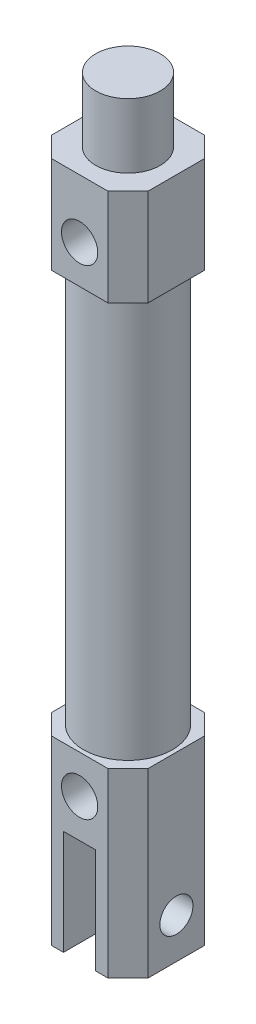
ISO-10303-21;
HEADER;
FILE_DESCRIPTION(('STEP AP214'),'2;1');
FILE_NAME('part.step','',(''),(''),'','','');
FILE_SCHEMA(('AUTOMOTIVE_DESIGN { 1 0 10303 214 1 1 1 1 }'));
ENDSEC;
DATA;
#1=APPLICATION_CONTEXT('core data for automotive mechanical design processes');
#2=APPLICATION_PROTOCOL_DEFINITION('international standard','automotive_design',2000,#1);
#3=PRODUCT_CONTEXT('',#1,'mechanical');
#4=PRODUCT('Part','Part','',(#3));
#5=PRODUCT_RELATED_PRODUCT_CATEGORY('part','',(#4));
#6=PRODUCT_DEFINITION_FORMATION('','',#4);
#7=PRODUCT_DEFINITION_CONTEXT('part definition',#1,'design');
#8=PRODUCT_DEFINITION('design','',#6,#7);
#9=PRODUCT_DEFINITION_SHAPE('','',#8);
#10=(LENGTH_UNIT() NAMED_UNIT(*) SI_UNIT(.MILLI.,.METRE.));
#11=(NAMED_UNIT(*) PLANE_ANGLE_UNIT() SI_UNIT($,.RADIAN.));
#12=(NAMED_UNIT(*) SI_UNIT($,.STERADIAN.) SOLID_ANGLE_UNIT());
#13=UNCERTAINTY_MEASURE_WITH_UNIT(LENGTH_MEASURE(1.E-05),#10,'distance_accuracy_value','');
#14=(GEOMETRIC_REPRESENTATION_CONTEXT(3) GLOBAL_UNCERTAINTY_ASSIGNED_CONTEXT((#13)) GLOBAL_UNIT_ASSIGNED_CONTEXT((#10,
#11,#12)) REPRESENTATION_CONTEXT('',''));
#15=CARTESIAN_POINT('',(0.,0.,0.));
#16=DIRECTION('',(0.,0.,1.));
#17=DIRECTION('',(1.,0.,0.));
#18=AXIS2_PLACEMENT_3D('',#15,#16,#17);
#19=CARTESIAN_POINT('',(0.,0.,0.));
#20=DIRECTION('',(0.,-1.,0.));
#21=DIRECTION('',(0.,0.,-1.));
#22=AXIS2_PLACEMENT_3D('',#19,#20,#21);
#23=PLANE('',#22);
#24=DIRECTION('',(0.,0.,1.));
#25=VECTOR('',#24,1.);
#26=CARTESIAN_POINT('',(-2.000000064,0.,-5.999999938));
#27=LINE('',#26,#25);
#28=CARTESIAN_POINT('',(-2.000000064,0.,-5.999999938));
#29=VERTEX_POINT('',#28);
#30=CARTESIAN_POINT('',(-2.000000064,0.,5.999999938));
#31=VERTEX_POINT('',#30);
#32=EDGE_CURVE('E207',#29,#31,#27,.T.);
#33=ORIENTED_EDGE('',*,*,#32,.T.);
#34=DIRECTION('',(1.,0.,0.));
#35=VECTOR('',#34,1.);
#36=CARTESIAN_POINT('',(-5.999999938,0.,5.999999938));
#37=LINE('',#36,#35);
#38=CARTESIAN_POINT('',(-3.49999985799998,0.,5.999999938));
#39=VERTEX_POINT('',#38);
#40=EDGE_CURVE('E250',#39,#31,#37,.T.);
#41=ORIENTED_EDGE('',*,*,#40,.F.);
#42=DIRECTION('',(0.707106781186546,0.,0.707106781186549));
#43=VECTOR('',#42,1.);
#44=CARTESIAN_POINT('',(-4.749999898,0.,4.74999989799997));
#45=LINE('',#44,#43);
#46=CARTESIAN_POINT('',(-5.999999938,0.,3.49999985799996));
#47=VERTEX_POINT('',#46);
#48=EDGE_CURVE('E271',#39,#47,#45,.F.);
#49=ORIENTED_EDGE('',*,*,#48,.T.);
#50=DIRECTION('',(0.,0.,1.));
#51=VECTOR('',#50,1.);
#52=CARTESIAN_POINT('',(-5.999999938,0.,5.999999938));
#53=LINE('',#52,#51);
#54=CARTESIAN_POINT('',(-5.999999938,0.,-3.49999985799998));
#55=VERTEX_POINT('',#54);
#56=EDGE_CURVE('E240',#55,#47,#53,.T.);
#57=ORIENTED_EDGE('',*,*,#56,.F.);
#58=DIRECTION('',(-0.707106781186549,0.,0.707106781186546));
#59=VECTOR('',#58,1.);
#60=CARTESIAN_POINT('',(-4.74999989799997,0.,-4.749999898));
#61=LINE('',#60,#59);
#62=CARTESIAN_POINT('',(-3.49999985799996,0.,-5.999999938));
#63=VERTEX_POINT('',#62);
#64=EDGE_CURVE('E231',#55,#63,#61,.F.);
#65=ORIENTED_EDGE('',*,*,#64,.T.);
#66=DIRECTION('',(-1.,0.,0.));
#67=VECTOR('',#66,1.);
#68=CARTESIAN_POINT('',(-5.999999938,0.,-5.999999938));
#69=LINE('',#68,#67);
#70=EDGE_CURVE('E224',#29,#63,#69,.T.);
#71=ORIENTED_EDGE('',*,*,#70,.F.);
#72=EDGE_LOOP('',(#33,#41,#49,#57,#65,#71));
#73=FACE_BOUND('',#72,.T.);
#74=ADVANCED_FACE('F51',(#73),#23,.T.);
#75=CARTESIAN_POINT('',(5.999999938,22.499999958,5.999999938));
#76=DIRECTION('',(-1.,0.,0.));
#77=DIRECTION('',(0.,0.,1.));
#78=AXIS2_PLACEMENT_3D('',#75,#76,#77);
#79=PLANE('',#78);
#80=CARTESIAN_POINT('',(5.999999938,4.999999906,0.));
#81=DIRECTION('',(1.,0.,0.));
#82=DIRECTION('',(0.,0.,-1.));
#83=AXIS2_PLACEMENT_3D('',#80,#81,#82);
#84=CIRCLE('',#83,2.049999964);
#85=CARTESIAN_POINT('',(5.999999938,4.999999906,-2.049999964));
#86=VERTEX_POINT('',#85);
#87=EDGE_CURVE('E616',#86,#86,#84,.T.);
#88=ORIENTED_EDGE('',*,*,#87,.F.);
#89=EDGE_LOOP('',(#88));
#90=FACE_BOUND('',#89,.T.);
#91=DIRECTION('',(0.,0.,-1.));
#92=VECTOR('',#91,1.);
#93=CARTESIAN_POINT('',(5.999999938,0.,5.999999938));
#94=LINE('',#93,#92);
#95=CARTESIAN_POINT('',(5.999999938,0.,3.49999985799998));
#96=VERTEX_POINT('',#95);
#97=CARTESIAN_POINT('',(5.999999938,0.,-3.49999985799996));
#98=VERTEX_POINT('',#97);
#99=EDGE_CURVE('E235',#96,#98,#94,.T.);
#100=ORIENTED_EDGE('',*,*,#99,.T.);
#101=DIRECTION('',(0.,1.,0.));
#102=VECTOR('',#101,1.);
#103=CARTESIAN_POINT('',(5.999999938,22.499999958,-3.49999985799996));
#104=LINE('',#103,#102);
#105=CARTESIAN_POINT('',(5.999999938,22.499999958,-3.49999985799996));
#106=VERTEX_POINT('',#105);
#107=EDGE_CURVE('E304',#98,#106,#104,.T.);
#108=ORIENTED_EDGE('',*,*,#107,.T.);
#109=DIRECTION('',(0.,0.,-1.));
#110=VECTOR('',#109,1.);
#111=CARTESIAN_POINT('',(5.999999938,22.499999958,5.999999938));
#112=LINE('',#111,#110);
#113=CARTESIAN_POINT('',(5.999999938,22.499999958,3.49999985799998));
#114=VERTEX_POINT('',#113);
#115=EDGE_CURVE('E253',#114,#106,#112,.T.);
#116=ORIENTED_EDGE('',*,*,#115,.F.);
#117=DIRECTION('',(0.,-1.,0.));
#118=VECTOR('',#117,1.);
#119=CARTESIAN_POINT('',(5.999999938,22.499999958,3.49999985799998));
#120=LINE('',#119,#118);
#121=EDGE_CURVE('E300',#114,#96,#120,.T.);
#122=ORIENTED_EDGE('',*,*,#121,.T.);
#123=EDGE_LOOP('',(#100,#108,#116,#122));
#124=FACE_BOUND('',#123,.T.);
#125=ADVANCED_FACE('F432',(#90,#124),#79,.F.);
#126=CARTESIAN_POINT('',(-5.999999938,22.499999958,-5.999999938));
#127=DIRECTION('',(0.,0.,1.));
#128=DIRECTION('',(1.,0.,0.));
#129=AXIS2_PLACEMENT_3D('',#126,#127,#128);
#130=PLANE('',#129);
#131=DIRECTION('',(-1.,0.,0.));
#132=VECTOR('',#131,1.);
#133=CARTESIAN_POINT('',(-2.000000064,12.999999908,-5.999999938));
#134=LINE('',#133,#132);
#135=CARTESIAN_POINT('',(2.000000064,12.999999908,-5.999999938));
#136=VERTEX_POINT('',#135);
#137=CARTESIAN_POINT('',(-2.000000064,12.999999908,-5.999999938));
#138=VERTEX_POINT('',#137);
#139=EDGE_CURVE('E220',#136,#138,#134,.T.);
#140=ORIENTED_EDGE('',*,*,#139,.T.);
#141=DIRECTION('',(0.,-1.,0.));
#142=VECTOR('',#141,1.);
#143=CARTESIAN_POINT('',(-2.000000064,0.,-5.999999938));
#144=LINE('',#143,#142);
#145=EDGE_CURVE('E210',#138,#29,#144,.T.);
#146=ORIENTED_EDGE('',*,*,#145,.T.);
#147=ORIENTED_EDGE('',*,*,#70,.T.);
#148=DIRECTION('',(0.,1.,0.));
#149=VECTOR('',#148,1.);
#150=CARTESIAN_POINT('',(-3.49999985799996,22.499999958,-5.999999938));
#151=LINE('',#150,#149);
#152=CARTESIAN_POINT('',(-3.49999985799996,22.499999958,-5.999999938));
#153=VERTEX_POINT('',#152);
#154=EDGE_CURVE('E297',#63,#153,#151,.T.);
#155=ORIENTED_EDGE('',*,*,#154,.T.);
#156=DIRECTION('',(-1.,0.,0.));
#157=VECTOR('',#156,1.);
#158=CARTESIAN_POINT('',(-5.999999938,22.499999958,-5.999999938));
#159=LINE('',#158,#157);
#160=CARTESIAN_POINT('',(3.49999985799998,22.499999958,-5.999999938));
#161=VERTEX_POINT('',#160);
#162=EDGE_CURVE('E408',#161,#153,#159,.T.);
#163=ORIENTED_EDGE('',*,*,#162,.F.);
#164=DIRECTION('',(0.,-1.,0.));
#165=VECTOR('',#164,1.);
#166=CARTESIAN_POINT('',(3.49999985799998,22.499999958,-5.999999938));
#167=LINE('',#166,#165);
#168=CARTESIAN_POINT('',(3.49999985799998,0.,-5.999999938));
#169=VERTEX_POINT('',#168);
#170=EDGE_CURVE('E293',#161,#169,#167,.T.);
#171=ORIENTED_EDGE('',*,*,#170,.T.);
#172=CARTESIAN_POINT('',(2.000000064,0.,-5.999999938));
#173=VERTEX_POINT('',#172);
#174=EDGE_CURVE('E234',#169,#173,#69,.T.);
#175=ORIENTED_EDGE('',*,*,#174,.T.);
#176=DIRECTION('',(0.,1.,0.));
#177=VECTOR('',#176,1.);
#178=CARTESIAN_POINT('',(2.000000064,0.,-5.999999938));
#179=LINE('',#178,#177);
#180=EDGE_CURVE('E69',#173,#136,#179,.T.);
#181=ORIENTED_EDGE('',*,*,#180,.T.);
#182=EDGE_LOOP('',(#140,#146,#147,#155,#163,#171,#175,#181));
#183=FACE_BOUND('',#182,.T.);
#184=ADVANCED_FACE('F223',(#183),#130,.F.);
#185=CARTESIAN_POINT('',(-5.999999938,22.499999958,5.999999938));
#186=DIRECTION('',(1.,0.,0.));
#187=DIRECTION('',(0.,0.,-1.));
#188=AXIS2_PLACEMENT_3D('',#185,#186,#187);
#189=PLANE('',#188);
#190=CARTESIAN_POINT('',(-5.999999938,4.999999906,0.));
#191=DIRECTION('',(1.,0.,0.));
#192=DIRECTION('',(0.,0.,-1.));
#193=AXIS2_PLACEMENT_3D('',#190,#191,#192);
#194=CIRCLE('',#193,2.049999964);
#195=CARTESIAN_POINT('',(-5.999999938,4.999999906,-2.049999964));
#196=VERTEX_POINT('',#195);
#197=EDGE_CURVE('E618',#196,#196,#194,.T.);
#198=ORIENTED_EDGE('',*,*,#197,.T.);
#199=EDGE_LOOP('',(#198));
#200=FACE_BOUND('',#199,.T.);
#201=ORIENTED_EDGE('',*,*,#56,.T.);
#202=DIRECTION('',(0.,1.,0.));
#203=VECTOR('',#202,1.);
#204=CARTESIAN_POINT('',(-5.999999938,22.499999958,3.49999985799996));
#205=LINE('',#204,#203);
#206=CARTESIAN_POINT('',(-5.999999938,22.499999958,3.49999985799996));
#207=VERTEX_POINT('',#206);
#208=EDGE_CURVE('E278',#47,#207,#205,.T.);
#209=ORIENTED_EDGE('',*,*,#208,.T.);
#210=DIRECTION('',(0.,0.,1.));
#211=VECTOR('',#210,1.);
#212=CARTESIAN_POINT('',(-5.999999938,22.499999958,5.999999938));
#213=LINE('',#212,#211);
#214=CARTESIAN_POINT('',(-5.999999938,22.499999958,-3.49999985799998));
#215=VERTEX_POINT('',#214);
#216=EDGE_CURVE('E412',#215,#207,#213,.T.);
#217=ORIENTED_EDGE('',*,*,#216,.F.);
#218=DIRECTION('',(0.,-1.,0.));
#219=VECTOR('',#218,1.);
#220=CARTESIAN_POINT('',(-5.999999938,22.499999958,-3.49999985799998));
#221=LINE('',#220,#219);
#222=EDGE_CURVE('E274',#215,#55,#221,.T.);
#223=ORIENTED_EDGE('',*,*,#222,.T.);
#224=EDGE_LOOP('',(#201,#209,#217,#223));
#225=FACE_BOUND('',#224,.T.);
#226=ADVANCED_FACE('F449',(#200,#225),#189,.F.);
#227=CARTESIAN_POINT('',(-5.999999938,22.499999958,5.999999938));
#228=DIRECTION('',(0.,0.,-1.));
#229=DIRECTION('',(-1.,0.,0.));
#230=AXIS2_PLACEMENT_3D('',#227,#228,#229);
#231=PLANE('',#230);
#232=CARTESIAN_POINT('',(0.,17.749999806,5.999999938));
#233=DIRECTION('',(0.,0.,1.));
#234=DIRECTION('',(1.,0.,0.));
#235=AXIS2_PLACEMENT_3D('',#232,#233,#234);
#236=CIRCLE('',#235,2.250000072);
#237=CARTESIAN_POINT('',(2.250000072,17.749999806,5.999999938));
#238=VERTEX_POINT('',#237);
#239=EDGE_CURVE('E603',#238,#238,#236,.T.);
#240=ORIENTED_EDGE('',*,*,#239,.F.);
#241=EDGE_LOOP('',(#240));
#242=FACE_BOUND('',#241,.T.);
#243=ORIENTED_EDGE('',*,*,#40,.T.);
#244=DIRECTION('',(0.,-1.,0.));
#245=VECTOR('',#244,1.);
#246=CARTESIAN_POINT('',(-2.000000064,0.,5.999999938));
#247=LINE('',#246,#245);
#248=CARTESIAN_POINT('',(-2.000000064,12.999999908,5.999999938));
#249=VERTEX_POINT('',#248);
#250=EDGE_CURVE('E213',#249,#31,#247,.T.);
#251=ORIENTED_EDGE('',*,*,#250,.F.);
#252=DIRECTION('',(-1.,0.,0.));
#253=VECTOR('',#252,1.);
#254=CARTESIAN_POINT('',(-2.000000064,12.999999908,5.999999938));
#255=LINE('',#254,#253);
#256=CARTESIAN_POINT('',(2.000000064,12.999999908,5.999999938));
#257=VERTEX_POINT('',#256);
#258=EDGE_CURVE('E228',#257,#249,#255,.T.);
#259=ORIENTED_EDGE('',*,*,#258,.F.);
#260=DIRECTION('',(0.,1.,0.));
#261=VECTOR('',#260,1.);
#262=CARTESIAN_POINT('',(2.000000064,0.,5.999999938));
#263=LINE('',#262,#261);
#264=CARTESIAN_POINT('',(2.000000064,0.,5.999999938));
#265=VERTEX_POINT('',#264);
#266=EDGE_CURVE('E458',#265,#257,#263,.T.);
#267=ORIENTED_EDGE('',*,*,#266,.F.);
#268=CARTESIAN_POINT('',(3.49999985799996,0.,5.999999938));
#269=VERTEX_POINT('',#268);
#270=EDGE_CURVE('E249',#265,#269,#37,.T.);
#271=ORIENTED_EDGE('',*,*,#270,.T.);
#272=DIRECTION('',(0.,1.,0.));
#273=VECTOR('',#272,1.);
#274=CARTESIAN_POINT('',(3.49999985799996,22.499999958,5.999999938));
#275=LINE('',#274,#273);
#276=CARTESIAN_POINT('',(3.49999985799996,22.499999958,5.999999938));
#277=VERTEX_POINT('',#276);
#278=EDGE_CURVE('E254',#269,#277,#275,.T.);
#279=ORIENTED_EDGE('',*,*,#278,.T.);
#280=DIRECTION('',(1.,0.,0.));
#281=VECTOR('',#280,1.);
#282=CARTESIAN_POINT('',(-5.999999938,22.499999958,5.999999938));
#283=LINE('',#282,#281);
#284=CARTESIAN_POINT('',(-3.49999985799998,22.499999958,5.999999938));
#285=VERTEX_POINT('',#284);
#286=EDGE_CURVE('E404',#285,#277,#283,.T.);
#287=ORIENTED_EDGE('',*,*,#286,.F.);
#288=DIRECTION('',(0.,-1.,0.));
#289=VECTOR('',#288,1.);
#290=CARTESIAN_POINT('',(-3.49999985799998,22.499999958,5.999999938));
#291=LINE('',#290,#289);
#292=EDGE_CURVE('E257',#285,#39,#291,.T.);
#293=ORIENTED_EDGE('',*,*,#292,.T.);
#294=EDGE_LOOP('',(#243,#251,#259,#267,#271,#279,#287,#293));
#295=FACE_BOUND('',#294,.T.);
#296=ADVANCED_FACE('F453',(#242,#295),#231,.F.);
#297=CARTESIAN_POINT('',(0.,22.499999958,0.));
#298=DIRECTION('',(0.,-1.,0.));
#299=DIRECTION('',(0.,0.,-1.));
#300=AXIS2_PLACEMENT_3D('',#297,#298,#299);
#301=PLANE('',#300);
#302=CARTESIAN_POINT('',(0.,22.499999958,0.));
#303=DIRECTION('',(0.,1.,0.));
#304=DIRECTION('',(0.,0.,1.));
#305=AXIS2_PLACEMENT_3D('',#302,#303,#304);
#306=CIRCLE('',#305,5.499999922);
#307=CARTESIAN_POINT('',(0.,22.499999958,5.499999922));
#308=VERTEX_POINT('',#307);
#309=EDGE_CURVE('E400',#308,#308,#306,.T.);
#310=ORIENTED_EDGE('',*,*,#309,.F.);
#311=EDGE_LOOP('',(#310));
#312=FACE_BOUND('',#311,.T.);
#313=ORIENTED_EDGE('',*,*,#216,.T.);
#314=DIRECTION('',(-0.707106781186546,0.,-0.707106781186549));
#315=VECTOR('',#314,1.);
#316=CARTESIAN_POINT('',(-3.49999985799998,22.499999958,5.999999938));
#317=LINE('',#316,#315);
#318=EDGE_CURVE('E290',#207,#285,#317,.F.);
#319=ORIENTED_EDGE('',*,*,#318,.T.);
#320=ORIENTED_EDGE('',*,*,#286,.T.);
#321=DIRECTION('',(-0.707106781186549,0.,0.707106781186546));
#322=VECTOR('',#321,1.);
#323=CARTESIAN_POINT('',(5.999999938,22.499999958,3.49999985799998));
#324=LINE('',#323,#322);
#325=EDGE_CURVE('E281',#277,#114,#324,.F.);
#326=ORIENTED_EDGE('',*,*,#325,.T.);
#327=ORIENTED_EDGE('',*,*,#115,.T.);
#328=DIRECTION('',(0.707106781186546,0.,0.707106781186549));
#329=VECTOR('',#328,1.);
#330=CARTESIAN_POINT('',(3.49999985799998,22.499999958,-5.999999938));
#331=LINE('',#330,#329);
#332=EDGE_CURVE('E284',#106,#161,#331,.F.);
#333=ORIENTED_EDGE('',*,*,#332,.T.);
#334=ORIENTED_EDGE('',*,*,#162,.T.);
#335=DIRECTION('',(0.707106781186549,0.,-0.707106781186546));
#336=VECTOR('',#335,1.);
#337=CARTESIAN_POINT('',(-5.999999938,22.499999958,-3.49999985799998));
#338=LINE('',#337,#336);
#339=EDGE_CURVE('E287',#153,#215,#338,.F.);
#340=ORIENTED_EDGE('',*,*,#339,.T.);
#341=EDGE_LOOP('',(#313,#319,#320,#326,#327,#333,#334,#340));
#342=FACE_BOUND('',#341,.T.);
#343=ADVANCED_FACE('F421',(#312,#342),#301,.F.);
#344=DIRECTION('',(0.,0.,1.));
#345=VECTOR('',#344,1.);
#346=CARTESIAN_POINT('',(2.000000064,0.,-5.999999938));
#347=LINE('',#346,#345);
#348=EDGE_CURVE('E219',#173,#265,#347,.T.);
#349=ORIENTED_EDGE('',*,*,#348,.F.);
#350=ORIENTED_EDGE('',*,*,#174,.F.);
#351=DIRECTION('',(-0.707106781186546,0.,-0.707106781186549));
#352=VECTOR('',#351,1.);
#353=CARTESIAN_POINT('',(4.749999898,0.,-4.74999989799997));
#354=LINE('',#353,#352);
#355=EDGE_CURVE('E266',#169,#98,#354,.F.);
#356=ORIENTED_EDGE('',*,*,#355,.T.);
#357=ORIENTED_EDGE('',*,*,#99,.F.);
#358=DIRECTION('',(0.707106781186549,0.,-0.707106781186546));
#359=VECTOR('',#358,1.);
#360=CARTESIAN_POINT('',(4.74999989799997,0.,4.749999898));
#361=LINE('',#360,#359);
#362=EDGE_CURVE('E262',#96,#269,#361,.F.);
#363=ORIENTED_EDGE('',*,*,#362,.T.);
#364=ORIENTED_EDGE('',*,*,#270,.F.);
#365=EDGE_LOOP('',(#349,#350,#356,#357,#363,#364));
#366=FACE_BOUND('',#365,.T.);
#367=ADVANCED_FACE('F435',(#366),#23,.T.);
#368=CARTESIAN_POINT('',(0.,72.500000034,0.));
#369=DIRECTION('',(0.,-1.,0.));
#370=DIRECTION('',(0.,0.,-1.));
#371=AXIS2_PLACEMENT_3D('',#368,#369,#370);
#372=CYLINDRICAL_SURFACE('',#371,5.499999922);
#373=CARTESIAN_POINT('',(0.,72.500000034,0.));
#374=DIRECTION('',(0.,1.,0.));
#375=DIRECTION('',(0.,0.,1.));
#376=AXIS2_PLACEMENT_3D('',#373,#374,#375);
#377=CIRCLE('',#376,5.499999922);
#378=CARTESIAN_POINT('',(0.,72.500000034,5.499999922));
#379=VERTEX_POINT('',#378);
#380=EDGE_CURVE('E242',#379,#379,#377,.T.);
#381=ORIENTED_EDGE('',*,*,#380,.F.);
#382=EDGE_LOOP('',(#381));
#383=FACE_BOUND('',#382,.T.);
#384=ORIENTED_EDGE('',*,*,#309,.T.);
#385=EDGE_LOOP('',(#384));
#386=FACE_BOUND('',#385,.T.);
#387=ADVANCED_FACE('F530',(#383,#386),#372,.T.);
#388=CARTESIAN_POINT('',(5.999999938,84.49999991,-5.999999938));
#389=DIRECTION('',(-1.,0.,0.));
#390=DIRECTION('',(0.,0.,1.));
#391=AXIS2_PLACEMENT_3D('',#388,#389,#390);
#392=PLANE('',#391);
#393=DIRECTION('',(0.,0.,-1.));
#394=VECTOR('',#393,1.);
#395=CARTESIAN_POINT('',(5.999999938,84.49999991,-5.999999938));
#396=LINE('',#395,#394);
#397=CARTESIAN_POINT('',(5.999999938,84.49999991,3.49999985799998));
#398=VERTEX_POINT('',#397);
#399=CARTESIAN_POINT('',(5.999999938,84.49999991,-3.49999985799996));
#400=VERTEX_POINT('',#399);
#401=EDGE_CURVE('E358',#398,#400,#396,.T.);
#402=ORIENTED_EDGE('',*,*,#401,.F.);
#403=DIRECTION('',(0.,-1.,0.));
#404=VECTOR('',#403,1.);
#405=CARTESIAN_POINT('',(5.999999938,84.49999991,3.49999985799998));
#406=LINE('',#405,#404);
#407=CARTESIAN_POINT('',(5.999999938,72.500000034,3.49999985799998));
#408=VERTEX_POINT('',#407);
#409=EDGE_CURVE('E11',#398,#408,#406,.T.);
#410=ORIENTED_EDGE('',*,*,#409,.T.);
#411=DIRECTION('',(0.,0.,-1.));
#412=VECTOR('',#411,1.);
#413=CARTESIAN_POINT('',(5.999999938,72.500000034,-5.999999938));
#414=LINE('',#413,#412);
#415=CARTESIAN_POINT('',(5.999999938,72.500000034,-3.49999985799996));
#416=VERTEX_POINT('',#415);
#417=EDGE_CURVE('E361',#408,#416,#414,.T.);
#418=ORIENTED_EDGE('',*,*,#417,.T.);
#419=DIRECTION('',(0.,1.,0.));
#420=VECTOR('',#419,1.);
#421=CARTESIAN_POINT('',(5.999999938,84.49999991,-3.49999985799996));
#422=LINE('',#421,#420);
#423=EDGE_CURVE('E62',#416,#400,#422,.T.);
#424=ORIENTED_EDGE('',*,*,#423,.T.);
#425=EDGE_LOOP('',(#402,#410,#418,#424));
#426=FACE_BOUND('',#425,.T.);
#427=ADVANCED_FACE('F357',(#426),#392,.F.);
#428=CARTESIAN_POINT('',(-5.999999938,84.49999991,-5.999999938));
#429=DIRECTION('',(0.,0.,1.));
#430=DIRECTION('',(1.,0.,0.));
#431=AXIS2_PLACEMENT_3D('',#428,#429,#430);
#432=PLANE('',#431);
#433=DIRECTION('',(-1.,0.,0.));
#434=VECTOR('',#433,1.);
#435=CARTESIAN_POINT('',(-5.999999938,72.500000034,-5.999999938));
#436=LINE('',#435,#434);
#437=CARTESIAN_POINT('',(3.49999985799998,72.500000034,-5.999999938));
#438=VERTEX_POINT('',#437);
#439=CARTESIAN_POINT('',(-3.49999985799996,72.500000034,-5.999999938));
#440=VERTEX_POINT('',#439);
#441=EDGE_CURVE('E378',#438,#440,#436,.T.);
#442=ORIENTED_EDGE('',*,*,#441,.T.);
#443=DIRECTION('',(0.,1.,0.));
#444=VECTOR('',#443,1.);
#445=CARTESIAN_POINT('',(-3.49999985799996,84.49999991,-5.999999938));
#446=LINE('',#445,#444);
#447=CARTESIAN_POINT('',(-3.49999985799996,84.49999991,-5.999999938));
#448=VERTEX_POINT('',#447);
#449=EDGE_CURVE('E330',#440,#448,#446,.T.);
#450=ORIENTED_EDGE('',*,*,#449,.T.);
#451=DIRECTION('',(-1.,0.,0.));
#452=VECTOR('',#451,1.);
#453=CARTESIAN_POINT('',(-5.999999938,84.49999991,-5.999999938));
#454=LINE('',#453,#452);
#455=CARTESIAN_POINT('',(3.49999985799998,84.49999991,-5.999999938));
#456=VERTEX_POINT('',#455);
#457=EDGE_CURVE('E370',#456,#448,#454,.T.);
#458=ORIENTED_EDGE('',*,*,#457,.F.);
#459=DIRECTION('',(0.,-1.,0.));
#460=VECTOR('',#459,1.);
#461=CARTESIAN_POINT('',(3.49999985799998,84.49999991,-5.999999938));
#462=LINE('',#461,#460);
#463=EDGE_CURVE('E326',#456,#438,#462,.T.);
#464=ORIENTED_EDGE('',*,*,#463,.T.);
#465=EDGE_LOOP('',(#442,#450,#458,#464));
#466=FACE_BOUND('',#465,.T.);
#467=ADVANCED_FACE('F377',(#466),#432,.F.);
#468=CARTESIAN_POINT('',(-5.999999938,84.49999991,-5.999999938));
#469=DIRECTION('',(1.,0.,0.));
#470=DIRECTION('',(0.,0.,-1.));
#471=AXIS2_PLACEMENT_3D('',#468,#469,#470);
#472=PLANE('',#471);
#473=DIRECTION('',(0.,0.,1.));
#474=VECTOR('',#473,1.);
#475=CARTESIAN_POINT('',(-5.999999938,84.49999991,-5.999999938));
#476=LINE('',#475,#474);
#477=CARTESIAN_POINT('',(-5.999999938,84.49999991,-3.49999985799998));
#478=VERTEX_POINT('',#477);
#479=CARTESIAN_POINT('',(-5.999999938,84.49999991,3.49999985799996));
#480=VERTEX_POINT('',#479);
#481=EDGE_CURVE('E487',#478,#480,#476,.T.);
#482=ORIENTED_EDGE('',*,*,#481,.F.);
#483=DIRECTION('',(0.,-1.,0.));
#484=VECTOR('',#483,1.);
#485=CARTESIAN_POINT('',(-5.999999938,84.49999991,-3.49999985799998));
#486=LINE('',#485,#484);
#487=CARTESIAN_POINT('',(-5.999999938,72.500000034,-3.49999985799998));
#488=VERTEX_POINT('',#487);
#489=EDGE_CURVE('E310',#478,#488,#486,.T.);
#490=ORIENTED_EDGE('',*,*,#489,.T.);
#491=DIRECTION('',(0.,0.,1.));
#492=VECTOR('',#491,1.);
#493=CARTESIAN_POINT('',(-5.999999938,72.500000034,-5.999999938));
#494=LINE('',#493,#492);
#495=CARTESIAN_POINT('',(-5.999999938,72.500000034,3.49999985799996));
#496=VERTEX_POINT('',#495);
#497=EDGE_CURVE('E384',#488,#496,#494,.T.);
#498=ORIENTED_EDGE('',*,*,#497,.T.);
#499=DIRECTION('',(0.,1.,0.));
#500=VECTOR('',#499,1.);
#501=CARTESIAN_POINT('',(-5.999999938,84.49999991,3.49999985799996));
#502=LINE('',#501,#500);
#503=EDGE_CURVE('E307',#496,#480,#502,.T.);
#504=ORIENTED_EDGE('',*,*,#503,.T.);
#505=EDGE_LOOP('',(#482,#490,#498,#504));
#506=FACE_BOUND('',#505,.T.);
#507=ADVANCED_FACE('F503',(#506),#472,.F.);
#508=CARTESIAN_POINT('',(-5.999999938,84.49999991,5.999999938));
#509=DIRECTION('',(0.,0.,-1.));
#510=DIRECTION('',(-1.,0.,0.));
#511=AXIS2_PLACEMENT_3D('',#508,#509,#510);
#512=PLANE('',#511);
#513=CARTESIAN_POINT('',(0.,77.249999932,5.999999938));
#514=DIRECTION('',(0.,0.,1.));
#515=DIRECTION('',(1.,0.,0.));
#516=AXIS2_PLACEMENT_3D('',#513,#514,#515);
#517=CIRCLE('',#516,2.250000072);
#518=CARTESIAN_POINT('',(2.250000072,77.249999932,5.999999938));
#519=VERTEX_POINT('',#518);
#520=EDGE_CURVE('E604',#519,#519,#517,.T.);
#521=ORIENTED_EDGE('',*,*,#520,.F.);
#522=EDGE_LOOP('',(#521));
#523=FACE_BOUND('',#522,.T.);
#524=DIRECTION('',(1.,0.,0.));
#525=VECTOR('',#524,1.);
#526=CARTESIAN_POINT('',(-5.999999938,84.49999991,5.999999938));
#527=LINE('',#526,#525);
#528=CARTESIAN_POINT('',(-3.49999985799998,84.49999991,5.999999938));
#529=VERTEX_POINT('',#528);
#530=CARTESIAN_POINT('',(3.49999985799996,84.49999991,5.999999938));
#531=VERTEX_POINT('',#530);
#532=EDGE_CURVE('E399',#529,#531,#527,.T.);
#533=ORIENTED_EDGE('',*,*,#532,.F.);
#534=DIRECTION('',(0.,-1.,0.));
#535=VECTOR('',#534,1.);
#536=CARTESIAN_POINT('',(-3.49999985799998,84.49999991,5.999999938));
#537=LINE('',#536,#535);
#538=CARTESIAN_POINT('',(-3.49999985799998,72.500000034,5.999999938));
#539=VERTEX_POINT('',#538);
#540=EDGE_CURVE('E347',#529,#539,#537,.T.);
#541=ORIENTED_EDGE('',*,*,#540,.T.);
#542=DIRECTION('',(1.,0.,0.));
#543=VECTOR('',#542,1.);
#544=CARTESIAN_POINT('',(-5.999999938,72.500000034,5.999999938));
#545=LINE('',#544,#543);
#546=CARTESIAN_POINT('',(3.49999985799996,72.500000034,5.999999938));
#547=VERTEX_POINT('',#546);
#548=EDGE_CURVE('E371',#539,#547,#545,.T.);
#549=ORIENTED_EDGE('',*,*,#548,.T.);
#550=DIRECTION('',(0.,1.,0.));
#551=VECTOR('',#550,1.);
#552=CARTESIAN_POINT('',(3.49999985799996,84.49999991,5.999999938));
#553=LINE('',#552,#551);
#554=EDGE_CURVE('E80',#547,#531,#553,.T.);
#555=ORIENTED_EDGE('',*,*,#554,.T.);
#556=EDGE_LOOP('',(#533,#541,#549,#555));
#557=FACE_BOUND('',#556,.T.);
#558=ADVANCED_FACE('F497',(#523,#557),#512,.F.);
#559=CARTESIAN_POINT('',(0.,84.49999991,0.));
#560=DIRECTION('',(0.,1.,0.));
#561=DIRECTION('',(0.,0.,1.));
#562=AXIS2_PLACEMENT_3D('',#559,#560,#561);
#563=PLANE('',#562);
#564=CARTESIAN_POINT('',(0.,84.49999991,0.));
#565=DIRECTION('',(0.,1.,0.));
#566=DIRECTION('',(0.,0.,1.));
#567=AXIS2_PLACEMENT_3D('',#564,#565,#566);
#568=CIRCLE('',#567,4.000000128);
#569=CARTESIAN_POINT('',(0.,84.49999991,4.000000128));
#570=VERTEX_POINT('',#569);
#571=EDGE_CURVE('E258',#570,#570,#568,.T.);
#572=ORIENTED_EDGE('',*,*,#571,.F.);
#573=EDGE_LOOP('',(#572));
#574=FACE_BOUND('',#573,.T.);
#575=ORIENTED_EDGE('',*,*,#457,.T.);
#576=DIRECTION('',(0.707106781186549,0.,-0.707106781186546));
#577=VECTOR('',#576,1.);
#578=CARTESIAN_POINT('',(-4.74999989799997,84.49999991,-4.749999898));
#579=LINE('',#578,#577);
#580=EDGE_CURVE('E342',#448,#478,#579,.F.);
#581=ORIENTED_EDGE('',*,*,#580,.T.);
#582=ORIENTED_EDGE('',*,*,#481,.T.);
#583=DIRECTION('',(-0.707106781186546,0.,-0.707106781186549));
#584=VECTOR('',#583,1.);
#585=CARTESIAN_POINT('',(-4.749999898,84.49999991,4.74999989799997));
#586=LINE('',#585,#584);
#587=EDGE_CURVE('E339',#480,#529,#586,.F.);
#588=ORIENTED_EDGE('',*,*,#587,.T.);
#589=ORIENTED_EDGE('',*,*,#532,.T.);
#590=DIRECTION('',(-0.707106781186549,0.,0.707106781186546));
#591=VECTOR('',#590,1.);
#592=CARTESIAN_POINT('',(4.74999989799997,84.49999991,4.749999898));
#593=LINE('',#592,#591);
#594=EDGE_CURVE('E336',#531,#398,#593,.F.);
#595=ORIENTED_EDGE('',*,*,#594,.T.);
#596=ORIENTED_EDGE('',*,*,#401,.T.);
#597=DIRECTION('',(0.707106781186546,0.,0.707106781186549));
#598=VECTOR('',#597,1.);
#599=CARTESIAN_POINT('',(4.749999898,84.49999991,-4.74999989799997));
#600=LINE('',#599,#598);
#601=EDGE_CURVE('E333',#400,#456,#600,.F.);
#602=ORIENTED_EDGE('',*,*,#601,.T.);
#603=EDGE_LOOP('',(#575,#581,#582,#588,#589,#595,#596,#602));
#604=FACE_BOUND('',#603,.T.);
#605=ADVANCED_FACE('F366',(#574,#604),#563,.T.);
#606=CARTESIAN_POINT('',(0.,72.500000034,0.));
#607=DIRECTION('',(0.,1.,0.));
#608=DIRECTION('',(0.,0.,1.));
#609=AXIS2_PLACEMENT_3D('',#606,#607,#608);
#610=PLANE('',#609);
#611=ORIENTED_EDGE('',*,*,#380,.T.);
#612=EDGE_LOOP('',(#611));
#613=FACE_BOUND('',#612,.T.);
#614=ORIENTED_EDGE('',*,*,#497,.F.);
#615=DIRECTION('',(-0.707106781186549,0.,0.707106781186546));
#616=VECTOR('',#615,1.);
#617=CARTESIAN_POINT('',(-5.999999938,72.500000034,-3.49999985799998));
#618=LINE('',#617,#616);
#619=EDGE_CURVE('E323',#488,#440,#618,.F.);
#620=ORIENTED_EDGE('',*,*,#619,.T.);
#621=ORIENTED_EDGE('',*,*,#441,.F.);
#622=DIRECTION('',(-0.707106781186546,0.,-0.707106781186549));
#623=VECTOR('',#622,1.);
#624=CARTESIAN_POINT('',(3.49999985799998,72.500000034,-5.999999938));
#625=LINE('',#624,#623);
#626=EDGE_CURVE('E314',#438,#416,#625,.F.);
#627=ORIENTED_EDGE('',*,*,#626,.T.);
#628=ORIENTED_EDGE('',*,*,#417,.F.);
#629=DIRECTION('',(0.707106781186549,0.,-0.707106781186546));
#630=VECTOR('',#629,1.);
#631=CARTESIAN_POINT('',(5.999999938,72.500000034,3.49999985799998));
#632=LINE('',#631,#630);
#633=EDGE_CURVE('E317',#408,#547,#632,.F.);
#634=ORIENTED_EDGE('',*,*,#633,.T.);
#635=ORIENTED_EDGE('',*,*,#548,.F.);
#636=DIRECTION('',(0.707106781186546,0.,0.707106781186549));
#637=VECTOR('',#636,1.);
#638=CARTESIAN_POINT('',(-3.49999985799998,72.500000034,5.999999938));
#639=LINE('',#638,#637);
#640=EDGE_CURVE('E320',#539,#496,#639,.F.);
#641=ORIENTED_EDGE('',*,*,#640,.T.);
#642=EDGE_LOOP('',(#614,#620,#621,#627,#628,#634,#635,#641));
#643=FACE_BOUND('',#642,.T.);
#644=ADVANCED_FACE('F382',(#613,#643),#610,.F.);
#645=CARTESIAN_POINT('',(0.,92.499999912,0.));
#646=DIRECTION('',(0.,-1.,0.));
#647=DIRECTION('',(0.,0.,-1.));
#648=AXIS2_PLACEMENT_3D('',#645,#646,#647);
#649=CYLINDRICAL_SURFACE('',#648,4.000000128);
#650=CARTESIAN_POINT('',(0.,92.499999912,0.));
#651=DIRECTION('',(0.,1.,0.));
#652=DIRECTION('',(0.,0.,1.));
#653=AXIS2_PLACEMENT_3D('',#650,#651,#652);
#654=CIRCLE('',#653,4.000000128);
#655=CARTESIAN_POINT('',(0.,92.499999912,4.000000128));
#656=VERTEX_POINT('',#655);
#657=EDGE_CURVE('E390',#656,#656,#654,.T.);
#658=ORIENTED_EDGE('',*,*,#657,.F.);
#659=EDGE_LOOP('',(#658));
#660=FACE_BOUND('',#659,.T.);
#661=ORIENTED_EDGE('',*,*,#571,.T.);
#662=EDGE_LOOP('',(#661));
#663=FACE_BOUND('',#662,.T.);
#664=ADVANCED_FACE('F556',(#660,#663),#649,.T.);
#665=CARTESIAN_POINT('',(0.,92.499999912,0.));
#666=DIRECTION('',(0.,1.,0.));
#667=DIRECTION('',(0.,0.,1.));
#668=AXIS2_PLACEMENT_3D('',#665,#666,#667);
#669=PLANE('',#668);
#670=ORIENTED_EDGE('',*,*,#657,.T.);
#671=EDGE_LOOP('',(#670));
#672=FACE_BOUND('',#671,.T.);
#673=ADVANCED_FACE('F563',(#672),#669,.T.);
#674=CARTESIAN_POINT('',(-3.49999985799998,22.499999958,5.999999938));
#675=DIRECTION('',(0.707106781186549,0.,-0.707106781186546));
#676=DIRECTION('',(0.,-1.,0.));
#677=AXIS2_PLACEMENT_3D('',#674,#675,#676);
#678=PLANE('',#677);
#679=ORIENTED_EDGE('',*,*,#318,.F.);
#680=ORIENTED_EDGE('',*,*,#208,.F.);
#681=ORIENTED_EDGE('',*,*,#48,.F.);
#682=ORIENTED_EDGE('',*,*,#292,.F.);
#683=EDGE_LOOP('',(#679,#680,#681,#682));
#684=FACE_BOUND('',#683,.T.);
#685=ADVANCED_FACE('F452',(#684),#678,.F.);
#686=CARTESIAN_POINT('',(-5.999999938,22.499999958,-3.49999985799998));
#687=DIRECTION('',(0.707106781186546,0.,0.707106781186549));
#688=DIRECTION('',(0.,-1.,0.));
#689=AXIS2_PLACEMENT_3D('',#686,#687,#688);
#690=PLANE('',#689);
#691=ORIENTED_EDGE('',*,*,#339,.F.);
#692=ORIENTED_EDGE('',*,*,#154,.F.);
#693=ORIENTED_EDGE('',*,*,#64,.F.);
#694=ORIENTED_EDGE('',*,*,#222,.F.);
#695=EDGE_LOOP('',(#691,#692,#693,#694));
#696=FACE_BOUND('',#695,.T.);
#697=ADVANCED_FACE('F447',(#696),#690,.F.);
#698=CARTESIAN_POINT('',(3.49999985799998,22.499999958,-5.999999938));
#699=DIRECTION('',(-0.707106781186549,0.,0.707106781186546));
#700=DIRECTION('',(0.,-1.,0.));
#701=AXIS2_PLACEMENT_3D('',#698,#699,#700);
#702=PLANE('',#701);
#703=ORIENTED_EDGE('',*,*,#332,.F.);
#704=ORIENTED_EDGE('',*,*,#107,.F.);
#705=ORIENTED_EDGE('',*,*,#355,.F.);
#706=ORIENTED_EDGE('',*,*,#170,.F.);
#707=EDGE_LOOP('',(#703,#704,#705,#706));
#708=FACE_BOUND('',#707,.T.);
#709=ADVANCED_FACE('F441',(#708),#702,.F.);
#710=CARTESIAN_POINT('',(5.999999938,22.499999958,3.49999985799998));
#711=DIRECTION('',(-0.707106781186546,0.,-0.707106781186549));
#712=DIRECTION('',(0.,-1.,0.));
#713=AXIS2_PLACEMENT_3D('',#710,#711,#712);
#714=PLANE('',#713);
#715=ORIENTED_EDGE('',*,*,#325,.F.);
#716=ORIENTED_EDGE('',*,*,#278,.F.);
#717=ORIENTED_EDGE('',*,*,#362,.F.);
#718=ORIENTED_EDGE('',*,*,#121,.F.);
#719=EDGE_LOOP('',(#715,#716,#717,#718));
#720=FACE_BOUND('',#719,.T.);
#721=ADVANCED_FACE('F429',(#720),#714,.F.);
#722=CARTESIAN_POINT('',(-5.999999938,84.49999991,-3.49999985799998));
#723=DIRECTION('',(0.707106781186546,0.,0.707106781186549));
#724=DIRECTION('',(0.,-1.,0.));
#725=AXIS2_PLACEMENT_3D('',#722,#723,#724);
#726=PLANE('',#725);
#727=ORIENTED_EDGE('',*,*,#580,.F.);
#728=ORIENTED_EDGE('',*,*,#449,.F.);
#729=ORIENTED_EDGE('',*,*,#619,.F.);
#730=ORIENTED_EDGE('',*,*,#489,.F.);
#731=EDGE_LOOP('',(#727,#728,#729,#730));
#732=FACE_BOUND('',#731,.T.);
#733=ADVANCED_FACE('F507',(#732),#726,.F.);
#734=CARTESIAN_POINT('',(-3.49999985799998,84.49999991,5.999999938));
#735=DIRECTION('',(0.707106781186549,0.,-0.707106781186546));
#736=DIRECTION('',(0.,-1.,0.));
#737=AXIS2_PLACEMENT_3D('',#734,#735,#736);
#738=PLANE('',#737);
#739=ORIENTED_EDGE('',*,*,#587,.F.);
#740=ORIENTED_EDGE('',*,*,#503,.F.);
#741=ORIENTED_EDGE('',*,*,#640,.F.);
#742=ORIENTED_EDGE('',*,*,#540,.F.);
#743=EDGE_LOOP('',(#739,#740,#741,#742));
#744=FACE_BOUND('',#743,.T.);
#745=ADVANCED_FACE('F499',(#744),#738,.F.);
#746=CARTESIAN_POINT('',(5.999999938,84.49999991,3.49999985799998));
#747=DIRECTION('',(-0.707106781186546,0.,-0.707106781186549));
#748=DIRECTION('',(0.,-1.,0.));
#749=AXIS2_PLACEMENT_3D('',#746,#747,#748);
#750=PLANE('',#749);
#751=ORIENTED_EDGE('',*,*,#594,.F.);
#752=ORIENTED_EDGE('',*,*,#554,.F.);
#753=ORIENTED_EDGE('',*,*,#633,.F.);
#754=ORIENTED_EDGE('',*,*,#409,.F.);
#755=EDGE_LOOP('',(#751,#752,#753,#754));
#756=FACE_BOUND('',#755,.T.);
#757=ADVANCED_FACE('F495',(#756),#750,.F.);
#758=CARTESIAN_POINT('',(3.49999985799998,84.49999991,-5.999999938));
#759=DIRECTION('',(-0.707106781186549,0.,0.707106781186546));
#760=DIRECTION('',(0.,-1.,0.));
#761=AXIS2_PLACEMENT_3D('',#758,#759,#760);
#762=PLANE('',#761);
#763=ORIENTED_EDGE('',*,*,#601,.F.);
#764=ORIENTED_EDGE('',*,*,#423,.F.);
#765=ORIENTED_EDGE('',*,*,#626,.F.);
#766=ORIENTED_EDGE('',*,*,#463,.F.);
#767=EDGE_LOOP('',(#763,#764,#765,#766));
#768=FACE_BOUND('',#767,.T.);
#769=ADVANCED_FACE('F54',(#768),#762,.F.);
#770=CARTESIAN_POINT('',(-2.000000064,0.,-5.999999938));
#771=DIRECTION('',(-1.,0.,0.));
#772=DIRECTION('',(0.,0.,1.));
#773=AXIS2_PLACEMENT_3D('',#770,#771,#772);
#774=PLANE('',#773);
#775=CARTESIAN_POINT('',(-2.000000064,4.999999906,0.));
#776=DIRECTION('',(-1.,0.,0.));
#777=DIRECTION('',(0.,0.,1.));
#778=AXIS2_PLACEMENT_3D('',#775,#776,#777);
#779=CIRCLE('',#778,2.049999964);
#780=CARTESIAN_POINT('',(-2.000000064,4.999999906,2.049999964));
#781=VERTEX_POINT('',#780);
#782=EDGE_CURVE('E459',#781,#781,#779,.T.);
#783=ORIENTED_EDGE('',*,*,#782,.T.);
#784=EDGE_LOOP('',(#783));
#785=FACE_BOUND('',#784,.T.);
#786=ORIENTED_EDGE('',*,*,#250,.T.);
#787=ORIENTED_EDGE('',*,*,#32,.F.);
#788=ORIENTED_EDGE('',*,*,#145,.F.);
#789=DIRECTION('',(0.,0.,1.));
#790=VECTOR('',#789,1.);
#791=CARTESIAN_POINT('',(-2.000000064,12.999999908,-5.999999938));
#792=LINE('',#791,#790);
#793=EDGE_CURVE('E472',#138,#249,#792,.T.);
#794=ORIENTED_EDGE('',*,*,#793,.T.);
#795=EDGE_LOOP('',(#786,#787,#788,#794));
#796=FACE_BOUND('',#795,.T.);
#797=ADVANCED_FACE('F209',(#785,#796),#774,.F.);
#798=CARTESIAN_POINT('',(-2.000000064,12.999999908,-5.999999938));
#799=DIRECTION('',(0.,1.,0.));
#800=DIRECTION('',(0.,0.,1.));
#801=AXIS2_PLACEMENT_3D('',#798,#799,#800);
#802=PLANE('',#801);
#803=ORIENTED_EDGE('',*,*,#258,.T.);
#804=ORIENTED_EDGE('',*,*,#793,.F.);
#805=ORIENTED_EDGE('',*,*,#139,.F.);
#806=DIRECTION('',(0.,0.,1.));
#807=VECTOR('',#806,1.);
#808=CARTESIAN_POINT('',(2.000000064,12.999999908,-5.999999938));
#809=LINE('',#808,#807);
#810=EDGE_CURVE('E475',#136,#257,#809,.T.);
#811=ORIENTED_EDGE('',*,*,#810,.T.);
#812=EDGE_LOOP('',(#803,#804,#805,#811));
#813=FACE_BOUND('',#812,.T.);
#814=ADVANCED_FACE('F569',(#813),#802,.F.);
#815=CARTESIAN_POINT('',(2.000000064,0.,-5.999999938));
#816=DIRECTION('',(1.,0.,0.));
#817=DIRECTION('',(0.,0.,-1.));
#818=AXIS2_PLACEMENT_3D('',#815,#816,#817);
#819=PLANE('',#818);
#820=CARTESIAN_POINT('',(2.000000064,4.999999906,0.));
#821=DIRECTION('',(1.,0.,0.));
#822=DIRECTION('',(0.,0.,-1.));
#823=AXIS2_PLACEMENT_3D('',#820,#821,#822);
#824=CIRCLE('',#823,2.049999964);
#825=CARTESIAN_POINT('',(2.000000064,4.999999906,-2.049999964));
#826=VERTEX_POINT('',#825);
#827=EDGE_CURVE('E56',#826,#826,#824,.T.);
#828=ORIENTED_EDGE('',*,*,#827,.T.);
#829=EDGE_LOOP('',(#828));
#830=FACE_BOUND('',#829,.T.);
#831=ORIENTED_EDGE('',*,*,#266,.T.);
#832=ORIENTED_EDGE('',*,*,#810,.F.);
#833=ORIENTED_EDGE('',*,*,#180,.F.);
#834=ORIENTED_EDGE('',*,*,#348,.T.);
#835=EDGE_LOOP('',(#831,#832,#833,#834));
#836=FACE_BOUND('',#835,.T.);
#837=ADVANCED_FACE('F571',(#830,#836),#819,.F.);
#838=CARTESIAN_POINT('',(-5.999999938,4.999999906,0.));
#839=DIRECTION('',(1.,0.,0.));
#840=DIRECTION('',(0.,0.,-1.));
#841=AXIS2_PLACEMENT_3D('',#838,#839,#840);
#842=CYLINDRICAL_SURFACE('',#841,2.049999964);
#843=ORIENTED_EDGE('',*,*,#87,.T.);
#844=EDGE_LOOP('',(#843));
#845=FACE_BOUND('',#844,.T.);
#846=ORIENTED_EDGE('',*,*,#827,.F.);
#847=EDGE_LOOP('',(#846));
#848=FACE_BOUND('',#847,.T.);
#849=ADVANCED_FACE('F574',(#845,#848),#842,.F.);
#850=ORIENTED_EDGE('',*,*,#197,.F.);
#851=EDGE_LOOP('',(#850));
#852=FACE_BOUND('',#851,.T.);
#853=ORIENTED_EDGE('',*,*,#782,.F.);
#854=EDGE_LOOP('',(#853));
#855=FACE_BOUND('',#854,.T.);
#856=ADVANCED_FACE('F578',(#852,#855),#842,.F.);
#857=CARTESIAN_POINT('',(0.,17.749999806,-1.000000032));
#858=DIRECTION('',(0.,0.,1.));
#859=DIRECTION('',(1.,0.,0.));
#860=AXIS2_PLACEMENT_3D('',#857,#858,#859);
#861=CYLINDRICAL_SURFACE('',#860,2.250000072);
#862=CARTESIAN_POINT('',(0.,17.749999806,-1.000000032));
#863=DIRECTION('',(0.,0.,1.));
#864=DIRECTION('',(1.,0.,0.));
#865=AXIS2_PLACEMENT_3D('',#862,#863,#864);
#866=CIRCLE('',#865,2.250000072);
#867=CARTESIAN_POINT('',(2.250000072,17.749999806,-1.000000032));
#868=VERTEX_POINT('',#867);
#869=EDGE_CURVE('E608',#868,#868,#866,.T.);
#870=ORIENTED_EDGE('',*,*,#869,.F.);
#871=EDGE_LOOP('',(#870));
#872=FACE_BOUND('',#871,.T.);
#873=ORIENTED_EDGE('',*,*,#239,.T.);
#874=EDGE_LOOP('',(#873));
#875=FACE_BOUND('',#874,.T.);
#876=ADVANCED_FACE('F581',(#872,#875),#861,.F.);
#877=CARTESIAN_POINT('',(0.,17.749999806,-1.000000032));
#878=DIRECTION('',(0.,0.,1.));
#879=DIRECTION('',(1.,0.,0.));
#880=AXIS2_PLACEMENT_3D('',#877,#878,#879);
#881=PLANE('',#880);
#882=ORIENTED_EDGE('',*,*,#869,.T.);
#883=EDGE_LOOP('',(#882));
#884=FACE_BOUND('',#883,.T.);
#885=ADVANCED_FACE('F585',(#884),#881,.T.);
#886=CARTESIAN_POINT('',(0.,77.249999932,-1.000000032));
#887=DIRECTION('',(0.,0.,1.));
#888=DIRECTION('',(1.,0.,0.));
#889=AXIS2_PLACEMENT_3D('',#886,#887,#888);
#890=CYLINDRICAL_SURFACE('',#889,2.250000072);
#891=CARTESIAN_POINT('',(0.,77.249999932,-1.000000032));
#892=DIRECTION('',(0.,0.,1.));
#893=DIRECTION('',(1.,0.,0.));
#894=AXIS2_PLACEMENT_3D('',#891,#892,#893);
#895=CIRCLE('',#894,2.250000072);
#896=CARTESIAN_POINT('',(2.250000072,77.249999932,-1.000000032));
#897=VERTEX_POINT('',#896);
#898=EDGE_CURVE('E601',#897,#897,#895,.T.);
#899=ORIENTED_EDGE('',*,*,#898,.F.);
#900=EDGE_LOOP('',(#899));
#901=FACE_BOUND('',#900,.T.);
#902=ORIENTED_EDGE('',*,*,#520,.T.);
#903=EDGE_LOOP('',(#902));
#904=FACE_BOUND('',#903,.T.);
#905=ADVANCED_FACE('F589',(#901,#904),#890,.F.);
#906=CARTESIAN_POINT('',(0.,77.249999932,-1.000000032));
#907=DIRECTION('',(0.,0.,1.));
#908=DIRECTION('',(1.,0.,0.));
#909=AXIS2_PLACEMENT_3D('',#906,#907,#908);
#910=PLANE('',#909);
#911=ORIENTED_EDGE('',*,*,#898,.T.);
#912=EDGE_LOOP('',(#911));
#913=FACE_BOUND('',#912,.T.);
#914=ADVANCED_FACE('F593',(#913),#910,.T.);
#915=CLOSED_SHELL('',(#74,#125,#184,#226,#296,#343,#367,#387,#427,#467,#507,#558,#605,#644,#664,
#673,#685,#697,#709,#721,#733,#745,#757,#769,#797,#814,#837,#849,#856,#876,#885,#905,#914));
#916=MANIFOLD_SOLID_BREP('B2',#915);
#917=ADVANCED_BREP_SHAPE_REPRESENTATION('',(#18,#916),#14);
#918=SHAPE_DEFINITION_REPRESENTATION(#9,#917);
ENDSEC;
END-ISO-10303-21;
